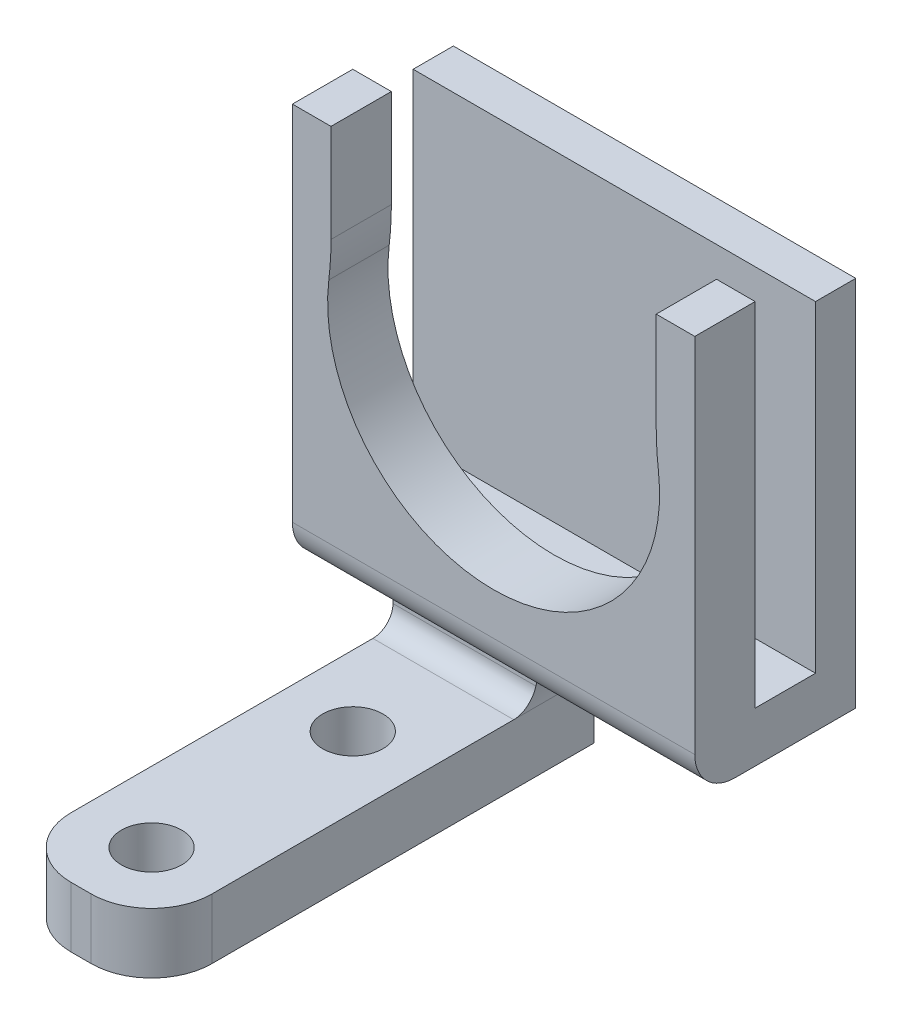
ISO-10303-21;
HEADER;
FILE_DESCRIPTION(('STEP AP214'),'2;1');
FILE_NAME('part.step','',(''),(''),'','','');
FILE_SCHEMA(('AUTOMOTIVE_DESIGN { 1 0 10303 214 1 1 1 1 }'));
ENDSEC;
DATA;
#1=APPLICATION_CONTEXT('core data for automotive mechanical design processes');
#2=APPLICATION_PROTOCOL_DEFINITION('international standard','automotive_design',2000,#1);
#3=PRODUCT_CONTEXT('',#1,'mechanical');
#4=PRODUCT('Part','Part','',(#3));
#5=PRODUCT_RELATED_PRODUCT_CATEGORY('part','',(#4));
#6=PRODUCT_DEFINITION_FORMATION('','',#4);
#7=PRODUCT_DEFINITION_CONTEXT('part definition',#1,'design');
#8=PRODUCT_DEFINITION('design','',#6,#7);
#9=PRODUCT_DEFINITION_SHAPE('','',#8);
#10=(LENGTH_UNIT() NAMED_UNIT(*) SI_UNIT(.MILLI.,.METRE.));
#11=(NAMED_UNIT(*) PLANE_ANGLE_UNIT() SI_UNIT($,.RADIAN.));
#12=(NAMED_UNIT(*) SI_UNIT($,.STERADIAN.) SOLID_ANGLE_UNIT());
#13=UNCERTAINTY_MEASURE_WITH_UNIT(LENGTH_MEASURE(1.E-05),#10,'distance_accuracy_value','');
#14=(GEOMETRIC_REPRESENTATION_CONTEXT(3) GLOBAL_UNCERTAINTY_ASSIGNED_CONTEXT((#13)) GLOBAL_UNIT_ASSIGNED_CONTEXT((#10,
#11,#12)) REPRESENTATION_CONTEXT('',''));
#15=CARTESIAN_POINT('',(0.,0.,0.));
#16=DIRECTION('',(0.,0.,1.));
#17=DIRECTION('',(1.,0.,0.));
#18=AXIS2_PLACEMENT_3D('',#15,#16,#17);
#19=CARTESIAN_POINT('',(0.,0.,3.));
#20=DIRECTION('',(0.,1.,0.));
#21=DIRECTION('',(0.,0.,1.));
#22=AXIS2_PLACEMENT_3D('',#19,#20,#21);
#23=PLANE('',#22);
#24=DIRECTION('',(0.,0.,-1.));
#25=VECTOR('',#24,1.);
#26=CARTESIAN_POINT('',(20.,0.,3.));
#27=LINE('',#26,#25);
#28=CARTESIAN_POINT('',(20.,0.,1.));
#29=VERTEX_POINT('',#28);
#30=CARTESIAN_POINT('',(20.,0.,-5.));
#31=VERTEX_POINT('',#30);
#32=EDGE_CURVE('E359',#29,#31,#27,.T.);
#33=ORIENTED_EDGE('',*,*,#32,.F.);
#34=DIRECTION('',(1.,0.,0.));
#35=VECTOR('',#34,1.);
#36=CARTESIAN_POINT('',(0.,0.,1.));
#37=LINE('',#36,#35);
#38=CARTESIAN_POINT('',(0.,0.,1.));
#39=VERTEX_POINT('',#38);
#40=EDGE_CURVE('E417',#29,#39,#37,.F.);
#41=ORIENTED_EDGE('',*,*,#40,.T.);
#42=DIRECTION('',(0.,0.,-1.));
#43=VECTOR('',#42,1.);
#44=CARTESIAN_POINT('',(0.,0.,-2.));
#45=LINE('',#44,#43);
#46=CARTESIAN_POINT('',(0.,0.,0.));
#47=VERTEX_POINT('',#46);
#48=EDGE_CURVE('E240',#39,#47,#45,.T.);
#49=ORIENTED_EDGE('',*,*,#48,.T.);
#50=DIRECTION('',(-1.,0.,0.));
#51=VECTOR('',#50,1.);
#52=CARTESIAN_POINT('',(12.,0.,0.));
#53=LINE('',#52,#51);
#54=CARTESIAN_POINT('',(12.,0.,0.));
#55=VERTEX_POINT('',#54);
#56=EDGE_CURVE('E413',#47,#55,#53,.F.);
#57=ORIENTED_EDGE('',*,*,#56,.T.);
#58=DIRECTION('',(0.,0.,1.));
#59=VECTOR('',#58,1.);
#60=CARTESIAN_POINT('',(12.,0.,-5.));
#61=LINE('',#60,#59);
#62=CARTESIAN_POINT('',(12.,0.,-5.));
#63=VERTEX_POINT('',#62);
#64=EDGE_CURVE('E397',#55,#63,#61,.F.);
#65=ORIENTED_EDGE('',*,*,#64,.T.);
#66=DIRECTION('',(-1.,0.,0.));
#67=VECTOR('',#66,1.);
#68=CARTESIAN_POINT('',(20.,0.,-5.));
#69=LINE('',#68,#67);
#70=EDGE_CURVE('E285',#31,#63,#69,.T.);
#71=ORIENTED_EDGE('',*,*,#70,.F.);
#72=EDGE_LOOP('',(#33,#41,#49,#57,#65,#71));
#73=FACE_BOUND('',#72,.T.);
#74=ADVANCED_FACE('F39',(#73),#23,.F.);
#75=CARTESIAN_POINT('',(20.,2.5,-5.));
#76=DIRECTION('',(0.,-1.,0.));
#77=DIRECTION('',(0.,0.,-1.));
#78=AXIS2_PLACEMENT_3D('',#75,#76,#77);
#79=PLANE('',#78);
#80=DIRECTION('',(1.,0.,0.));
#81=VECTOR('',#80,1.);
#82=CARTESIAN_POINT('',(20.,2.5,-3.));
#83=LINE('',#82,#81);
#84=CARTESIAN_POINT('',(0.,2.5,-3.));
#85=VERTEX_POINT('',#84);
#86=CARTESIAN_POINT('',(20.,2.5,-3.));
#87=VERTEX_POINT('',#86);
#88=EDGE_CURVE('E232',#85,#87,#83,.T.);
#89=ORIENTED_EDGE('',*,*,#88,.F.);
#90=DIRECTION('',(0.,0.,1.));
#91=VECTOR('',#90,1.);
#92=CARTESIAN_POINT('',(0.,2.5,-5.));
#93=LINE('',#92,#91);
#94=CARTESIAN_POINT('',(0.,2.5,0.));
#95=VERTEX_POINT('',#94);
#96=EDGE_CURVE('E297',#85,#95,#93,.T.);
#97=ORIENTED_EDGE('',*,*,#96,.T.);
#98=DIRECTION('',(1.,0.,0.));
#99=VECTOR('',#98,1.);
#100=CARTESIAN_POINT('',(20.,2.5,0.));
#101=LINE('',#100,#99);
#102=CARTESIAN_POINT('',(20.,2.5,0.));
#103=VERTEX_POINT('',#102);
#104=EDGE_CURVE('E281',#95,#103,#101,.T.);
#105=ORIENTED_EDGE('',*,*,#104,.T.);
#106=DIRECTION('',(0.,0.,1.));
#107=VECTOR('',#106,1.);
#108=CARTESIAN_POINT('',(20.,2.5,-5.));
#109=LINE('',#108,#107);
#110=EDGE_CURVE('E291',#87,#103,#109,.T.);
#111=ORIENTED_EDGE('',*,*,#110,.F.);
#112=EDGE_LOOP('',(#89,#97,#105,#111));
#113=FACE_BOUND('',#112,.T.);
#114=ADVANCED_FACE('F466',(#113),#79,.F.);
#115=CARTESIAN_POINT('',(10.,12.3440752769615,0.));
#116=DIRECTION('',(0.,0.,1.));
#117=DIRECTION('',(1.,0.,0.));
#118=AXIS2_PLACEMENT_3D('',#115,#116,#117);
#119=PLANE('',#118);
#120=CARTESIAN_POINT('',(10.,12.3440752769615,0.));
#121=DIRECTION('',(0.,0.,1.));
#122=DIRECTION('',(1.,0.,0.));
#123=AXIS2_PLACEMENT_3D('',#120,#121,#122);
#124=CIRCLE('',#123,8.25);
#125=CARTESIAN_POINT('',(1.80957581900882,13.3337478164588,0.));
#126=VERTEX_POINT('',#125);
#127=CARTESIAN_POINT('',(18.1904241809912,13.3337478164588,0.));
#128=VERTEX_POINT('',#127);
#129=EDGE_CURVE('E332',#126,#128,#124,.T.);
#130=ORIENTED_EDGE('',*,*,#129,.T.);
#131=CARTESIAN_POINT('',(33.082104510066,15.1331524337266,0.));
#132=DIRECTION('',(0.,0.,1.));
#133=DIRECTION('',(1.,0.,0.));
#134=AXIS2_PLACEMENT_3D('',#131,#132,#133);
#135=CIRCLE('',#134,15.);
#136=CARTESIAN_POINT('',(18.082104510066,15.1331524337266,0.));
#137=VERTEX_POINT('',#136);
#138=EDGE_CURVE('E379',#128,#137,#135,.F.);
#139=ORIENTED_EDGE('',*,*,#138,.T.);
#140=DIRECTION('',(0.,-1.,0.));
#141=VECTOR('',#140,1.);
#142=CARTESIAN_POINT('',(18.082104510066,20.,0.));
#143=LINE('',#142,#141);
#144=CARTESIAN_POINT('',(18.082104510066,20.,0.));
#145=VERTEX_POINT('',#144);
#146=EDGE_CURVE('E300',#145,#137,#143,.T.);
#147=ORIENTED_EDGE('',*,*,#146,.F.);
#148=DIRECTION('',(1.,0.,0.));
#149=VECTOR('',#148,1.);
#150=CARTESIAN_POINT('',(18.082104510066,20.,0.));
#151=LINE('',#150,#149);
#152=CARTESIAN_POINT('',(20.,20.,0.));
#153=VERTEX_POINT('',#152);
#154=EDGE_CURVE('E306',#145,#153,#151,.T.);
#155=ORIENTED_EDGE('',*,*,#154,.T.);
#156=DIRECTION('',(0.,1.,0.));
#157=VECTOR('',#156,1.);
#158=CARTESIAN_POINT('',(20.,0.,0.));
#159=LINE('',#158,#157);
#160=EDGE_CURVE('E347',#103,#153,#159,.T.);
#161=ORIENTED_EDGE('',*,*,#160,.F.);
#162=ORIENTED_EDGE('',*,*,#104,.F.);
#163=DIRECTION('',(0.,1.,0.));
#164=VECTOR('',#163,1.);
#165=CARTESIAN_POINT('',(0.,0.,0.));
#166=LINE('',#165,#164);
#167=CARTESIAN_POINT('',(0.,20.,0.));
#168=VERTEX_POINT('',#167);
#169=EDGE_CURVE('E344',#95,#168,#166,.T.);
#170=ORIENTED_EDGE('',*,*,#169,.T.);
#171=DIRECTION('',(1.,0.,0.));
#172=VECTOR('',#171,1.);
#173=CARTESIAN_POINT('',(0.,20.,0.));
#174=LINE('',#173,#172);
#175=CARTESIAN_POINT('',(1.91789548993395,20.,0.));
#176=VERTEX_POINT('',#175);
#177=EDGE_CURVE('E340',#168,#176,#174,.T.);
#178=ORIENTED_EDGE('',*,*,#177,.T.);
#179=DIRECTION('',(0.,-1.,0.));
#180=VECTOR('',#179,1.);
#181=CARTESIAN_POINT('',(1.91789548993395,20.,0.));
#182=LINE('',#181,#180);
#183=CARTESIAN_POINT('',(1.91789548993395,15.1331524337266,0.));
#184=VERTEX_POINT('',#183);
#185=EDGE_CURVE('E336',#176,#184,#182,.T.);
#186=ORIENTED_EDGE('',*,*,#185,.T.);
#187=CARTESIAN_POINT('',(-13.082104510066,15.1331524337266,0.));
#188=DIRECTION('',(0.,0.,1.));
#189=DIRECTION('',(1.,0.,0.));
#190=AXIS2_PLACEMENT_3D('',#187,#188,#189);
#191=CIRCLE('',#190,15.);
#192=EDGE_CURVE('E376',#184,#126,#191,.F.);
#193=ORIENTED_EDGE('',*,*,#192,.T.);
#194=EDGE_LOOP('',(#130,#139,#147,#155,#161,#162,#170,#178,#186,#193));
#195=FACE_BOUND('',#194,.T.);
#196=ADVANCED_FACE('F474',(#195),#119,.F.);
#197=CARTESIAN_POINT('',(18.082104510066,20.,3.));
#198=DIRECTION('',(1.,0.,0.));
#199=DIRECTION('',(0.,0.,-1.));
#200=AXIS2_PLACEMENT_3D('',#197,#198,#199);
#201=PLANE('',#200);
#202=ORIENTED_EDGE('',*,*,#146,.T.);
#203=DIRECTION('',(0.,0.,1.));
#204=VECTOR('',#203,1.);
#205=CARTESIAN_POINT('',(18.082104510066,15.1331524337266,3.));
#206=LINE('',#205,#204);
#207=CARTESIAN_POINT('',(18.082104510066,15.1331524337266,3.));
#208=VERTEX_POINT('',#207);
#209=EDGE_CURVE('E382',#137,#208,#206,.T.);
#210=ORIENTED_EDGE('',*,*,#209,.T.);
#211=DIRECTION('',(0.,-1.,0.));
#212=VECTOR('',#211,1.);
#213=CARTESIAN_POINT('',(18.082104510066,20.,3.));
#214=LINE('',#213,#212);
#215=CARTESIAN_POINT('',(18.082104510066,20.,3.));
#216=VERTEX_POINT('',#215);
#217=EDGE_CURVE('E301',#216,#208,#214,.T.);
#218=ORIENTED_EDGE('',*,*,#217,.F.);
#219=DIRECTION('',(0.,0.,-1.));
#220=VECTOR('',#219,1.);
#221=CARTESIAN_POINT('',(18.082104510066,20.,3.));
#222=LINE('',#221,#220);
#223=EDGE_CURVE('E328',#216,#145,#222,.T.);
#224=ORIENTED_EDGE('',*,*,#223,.T.);
#225=EDGE_LOOP('',(#202,#210,#218,#224));
#226=FACE_BOUND('',#225,.T.);
#227=ADVANCED_FACE('F495',(#226),#201,.F.);
#228=CARTESIAN_POINT('',(10.,12.3440752769615,3.));
#229=DIRECTION('',(0.,0.,-1.));
#230=DIRECTION('',(-1.,0.,0.));
#231=AXIS2_PLACEMENT_3D('',#228,#229,#230);
#232=CYLINDRICAL_SURFACE('',#231,8.25);
#233=CARTESIAN_POINT('',(10.,12.3440752769615,3.));
#234=DIRECTION('',(0.,0.,1.));
#235=DIRECTION('',(1.,0.,0.));
#236=AXIS2_PLACEMENT_3D('',#233,#234,#235);
#237=CIRCLE('',#236,8.25);
#238=CARTESIAN_POINT('',(1.80957581900882,13.3337478164588,3.));
#239=VERTEX_POINT('',#238);
#240=CARTESIAN_POINT('',(18.1904241809912,13.3337478164588,3.));
#241=VERTEX_POINT('',#240);
#242=EDGE_CURVE('E305',#239,#241,#237,.T.);
#243=ORIENTED_EDGE('',*,*,#242,.T.);
#244=DIRECTION('',(0.,0.,-1.));
#245=VECTOR('',#244,1.);
#246=CARTESIAN_POINT('',(18.1904241809912,13.3337478164588,3.));
#247=LINE('',#246,#245);
#248=EDGE_CURVE('E372',#241,#128,#247,.T.);
#249=ORIENTED_EDGE('',*,*,#248,.T.);
#250=ORIENTED_EDGE('',*,*,#129,.F.);
#251=DIRECTION('',(0.,0.,-1.));
#252=VECTOR('',#251,1.);
#253=CARTESIAN_POINT('',(1.80957581900882,13.3337478164588,3.));
#254=LINE('',#253,#252);
#255=EDGE_CURVE('E369',#126,#239,#254,.F.);
#256=ORIENTED_EDGE('',*,*,#255,.T.);
#257=EDGE_LOOP('',(#243,#249,#250,#256));
#258=FACE_BOUND('',#257,.T.);
#259=ADVANCED_FACE('F491',(#258),#232,.F.);
#260=CARTESIAN_POINT('',(1.91789548993395,20.,3.));
#261=DIRECTION('',(1.,0.,0.));
#262=DIRECTION('',(0.,1.,0.));
#263=AXIS2_PLACEMENT_3D('',#260,#261,#262);
#264=PLANE('',#263);
#265=DIRECTION('',(0.,-1.,0.));
#266=VECTOR('',#265,1.);
#267=CARTESIAN_POINT('',(1.91789548993395,20.,3.));
#268=LINE('',#267,#266);
#269=CARTESIAN_POINT('',(1.91789548993395,20.,3.));
#270=VERTEX_POINT('',#269);
#271=CARTESIAN_POINT('',(1.91789548993395,15.1331524337266,3.));
#272=VERTEX_POINT('',#271);
#273=EDGE_CURVE('E310',#270,#272,#268,.T.);
#274=ORIENTED_EDGE('',*,*,#273,.T.);
#275=DIRECTION('',(0.,0.,-1.));
#276=VECTOR('',#275,1.);
#277=CARTESIAN_POINT('',(1.91789548993395,15.1331524337266,3.));
#278=LINE('',#277,#276);
#279=EDGE_CURVE('E391',#272,#184,#278,.T.);
#280=ORIENTED_EDGE('',*,*,#279,.T.);
#281=ORIENTED_EDGE('',*,*,#185,.F.);
#282=DIRECTION('',(0.,0.,-1.));
#283=VECTOR('',#282,1.);
#284=CARTESIAN_POINT('',(1.91789548993395,20.,3.));
#285=LINE('',#284,#283);
#286=EDGE_CURVE('E366',#270,#176,#285,.T.);
#287=ORIENTED_EDGE('',*,*,#286,.F.);
#288=EDGE_LOOP('',(#274,#280,#281,#287));
#289=FACE_BOUND('',#288,.T.);
#290=ADVANCED_FACE('F487',(#289),#264,.T.);
#291=CARTESIAN_POINT('',(0.,20.,3.));
#292=DIRECTION('',(0.,1.,0.));
#293=DIRECTION('',(0.,0.,1.));
#294=AXIS2_PLACEMENT_3D('',#291,#292,#293);
#295=PLANE('',#294);
#296=ORIENTED_EDGE('',*,*,#177,.F.);
#297=DIRECTION('',(0.,0.,-1.));
#298=VECTOR('',#297,1.);
#299=CARTESIAN_POINT('',(0.,20.,3.));
#300=LINE('',#299,#298);
#301=CARTESIAN_POINT('',(0.,20.,3.));
#302=VERTEX_POINT('',#301);
#303=EDGE_CURVE('E362',#302,#168,#300,.T.);
#304=ORIENTED_EDGE('',*,*,#303,.F.);
#305=DIRECTION('',(1.,0.,0.));
#306=VECTOR('',#305,1.);
#307=CARTESIAN_POINT('',(0.,20.,3.));
#308=LINE('',#307,#306);
#309=EDGE_CURVE('E314',#302,#270,#308,.T.);
#310=ORIENTED_EDGE('',*,*,#309,.T.);
#311=ORIENTED_EDGE('',*,*,#286,.T.);
#312=EDGE_LOOP('',(#296,#304,#310,#311));
#313=FACE_BOUND('',#312,.T.);
#314=ADVANCED_FACE('F484',(#313),#295,.T.);
#315=CARTESIAN_POINT('',(0.,0.,3.));
#316=DIRECTION('',(-1.,0.,0.));
#317=DIRECTION('',(0.,0.,1.));
#318=AXIS2_PLACEMENT_3D('',#315,#316,#317);
#319=PLANE('',#318);
#320=DIRECTION('',(0.,0.,-1.));
#321=VECTOR('',#320,1.);
#322=CARTESIAN_POINT('',(0.,-8.,17.));
#323=LINE('',#322,#321);
#324=CARTESIAN_POINT('',(0.,-8.,14.));
#325=VERTEX_POINT('',#324);
#326=CARTESIAN_POINT('',(0.,-8.,-5.));
#327=VERTEX_POINT('',#326);
#328=EDGE_CURVE('E220',#325,#327,#323,.T.);
#329=ORIENTED_EDGE('',*,*,#328,.F.);
#330=DIRECTION('',(0.,-1.,0.));
#331=VECTOR('',#330,1.);
#332=CARTESIAN_POINT('',(0.,-5.,14.));
#333=LINE('',#332,#331);
#334=CARTESIAN_POINT('',(0.,-5.,14.));
#335=VERTEX_POINT('',#334);
#336=EDGE_CURVE('E631',#325,#335,#333,.F.);
#337=ORIENTED_EDGE('',*,*,#336,.T.);
#338=DIRECTION('',(0.,0.,-1.));
#339=VECTOR('',#338,1.);
#340=CARTESIAN_POINT('',(0.,-5.,17.));
#341=LINE('',#340,#339);
#342=CARTESIAN_POINT('',(0.,-5.,-1.));
#343=VERTEX_POINT('',#342);
#344=EDGE_CURVE('E253',#335,#343,#341,.T.);
#345=ORIENTED_EDGE('',*,*,#344,.T.);
#346=CARTESIAN_POINT('',(0.,-4.,-1.));
#347=DIRECTION('',(-1.,0.,0.));
#348=DIRECTION('',(0.,0.,1.));
#349=AXIS2_PLACEMENT_3D('',#346,#347,#348);
#350=CIRCLE('',#349,1.);
#351=CARTESIAN_POINT('',(0.,-4.,-2.));
#352=VERTEX_POINT('',#351);
#353=EDGE_CURVE('E54',#343,#352,#350,.F.);
#354=ORIENTED_EDGE('',*,*,#353,.T.);
#355=DIRECTION('',(0.,-1.,0.));
#356=VECTOR('',#355,1.);
#357=CARTESIAN_POINT('',(0.,0.,-2.));
#358=LINE('',#357,#356);
#359=CARTESIAN_POINT('',(0.,-2.,-2.));
#360=VERTEX_POINT('',#359);
#361=EDGE_CURVE('E247',#360,#352,#358,.T.);
#362=ORIENTED_EDGE('',*,*,#361,.F.);
#363=CARTESIAN_POINT('',(0.,-2.,0.));
#364=DIRECTION('',(-1.,0.,0.));
#365=DIRECTION('',(0.,0.,1.));
#366=AXIS2_PLACEMENT_3D('',#363,#364,#365);
#367=CIRCLE('',#366,2.);
#368=EDGE_CURVE('E427',#360,#47,#367,.F.);
#369=ORIENTED_EDGE('',*,*,#368,.T.);
#370=ORIENTED_EDGE('',*,*,#48,.F.);
#371=CARTESIAN_POINT('',(0.,2.,1.));
#372=DIRECTION('',(-1.,0.,0.));
#373=DIRECTION('',(0.,0.,1.));
#374=AXIS2_PLACEMENT_3D('',#371,#372,#373);
#375=CIRCLE('',#374,2.);
#376=CARTESIAN_POINT('',(0.,2.,3.));
#377=VERTEX_POINT('',#376);
#378=EDGE_CURVE('E420',#39,#377,#375,.T.);
#379=ORIENTED_EDGE('',*,*,#378,.T.);
#380=DIRECTION('',(0.,1.,0.));
#381=VECTOR('',#380,1.);
#382=CARTESIAN_POINT('',(0.,0.,3.));
#383=LINE('',#382,#381);
#384=EDGE_CURVE('E318',#377,#302,#383,.T.);
#385=ORIENTED_EDGE('',*,*,#384,.T.);
#386=ORIENTED_EDGE('',*,*,#303,.T.);
#387=ORIENTED_EDGE('',*,*,#169,.F.);
#388=ORIENTED_EDGE('',*,*,#96,.F.);
#389=DIRECTION('',(0.,-1.,0.));
#390=VECTOR('',#389,1.);
#391=CARTESIAN_POINT('',(0.,18.5,-3.));
#392=LINE('',#391,#390);
#393=CARTESIAN_POINT('',(0.,18.5,-3.));
#394=VERTEX_POINT('',#393);
#395=EDGE_CURVE('E278',#394,#85,#392,.T.);
#396=ORIENTED_EDGE('',*,*,#395,.F.);
#397=DIRECTION('',(0.,0.,1.));
#398=VECTOR('',#397,1.);
#399=CARTESIAN_POINT('',(0.,18.5,-5.));
#400=LINE('',#399,#398);
#401=CARTESIAN_POINT('',(0.,18.5,-5.));
#402=VERTEX_POINT('',#401);
#403=EDGE_CURVE('E266',#402,#394,#400,.T.);
#404=ORIENTED_EDGE('',*,*,#403,.F.);
#405=DIRECTION('',(0.,1.,0.));
#406=VECTOR('',#405,1.);
#407=CARTESIAN_POINT('',(0.,0.,-5.));
#408=LINE('',#407,#406);
#409=EDGE_CURVE('E288',#327,#402,#408,.T.);
#410=ORIENTED_EDGE('',*,*,#409,.F.);
#411=EDGE_LOOP('',(#329,#337,#345,#354,#362,#369,#370,#379,#385,#386,#387,#388,#396,#404,#410));
#412=FACE_BOUND('',#411,.T.);
#413=ADVANCED_FACE('F482',(#412),#319,.T.);
#414=CARTESIAN_POINT('',(20.,0.,3.));
#415=DIRECTION('',(-1.,0.,0.));
#416=DIRECTION('',(0.,0.,1.));
#417=AXIS2_PLACEMENT_3D('',#414,#415,#416);
#418=PLANE('',#417);
#419=DIRECTION('',(0.,1.,0.));
#420=VECTOR('',#419,1.);
#421=CARTESIAN_POINT('',(20.,0.,3.));
#422=LINE('',#421,#420);
#423=CARTESIAN_POINT('',(20.,2.,3.));
#424=VERTEX_POINT('',#423);
#425=CARTESIAN_POINT('',(20.,20.,3.));
#426=VERTEX_POINT('',#425);
#427=EDGE_CURVE('E321',#424,#426,#422,.T.);
#428=ORIENTED_EDGE('',*,*,#427,.F.);
#429=CARTESIAN_POINT('',(20.,2.,1.));
#430=DIRECTION('',(-1.,0.,0.));
#431=DIRECTION('',(0.,0.,1.));
#432=AXIS2_PLACEMENT_3D('',#429,#430,#431);
#433=CIRCLE('',#432,2.);
#434=EDGE_CURVE('E410',#424,#29,#433,.F.);
#435=ORIENTED_EDGE('',*,*,#434,.T.);
#436=ORIENTED_EDGE('',*,*,#32,.T.);
#437=DIRECTION('',(0.,-1.,0.));
#438=VECTOR('',#437,1.);
#439=CARTESIAN_POINT('',(20.,0.,-5.));
#440=LINE('',#439,#438);
#441=CARTESIAN_POINT('',(20.,18.5,-5.));
#442=VERTEX_POINT('',#441);
#443=EDGE_CURVE('E282',#442,#31,#440,.T.);
#444=ORIENTED_EDGE('',*,*,#443,.F.);
#445=DIRECTION('',(0.,0.,-1.));
#446=VECTOR('',#445,1.);
#447=CARTESIAN_POINT('',(20.,18.5,-5.));
#448=LINE('',#447,#446);
#449=CARTESIAN_POINT('',(20.,18.5,-3.));
#450=VERTEX_POINT('',#449);
#451=EDGE_CURVE('E258',#450,#442,#448,.T.);
#452=ORIENTED_EDGE('',*,*,#451,.F.);
#453=DIRECTION('',(0.,-1.,0.));
#454=VECTOR('',#453,1.);
#455=CARTESIAN_POINT('',(20.,18.5,-3.));
#456=LINE('',#455,#454);
#457=EDGE_CURVE('E272',#450,#87,#456,.T.);
#458=ORIENTED_EDGE('',*,*,#457,.T.);
#459=ORIENTED_EDGE('',*,*,#110,.T.);
#460=ORIENTED_EDGE('',*,*,#160,.T.);
#461=DIRECTION('',(0.,0.,-1.));
#462=VECTOR('',#461,1.);
#463=CARTESIAN_POINT('',(20.,20.,3.));
#464=LINE('',#463,#462);
#465=EDGE_CURVE('E355',#426,#153,#464,.T.);
#466=ORIENTED_EDGE('',*,*,#465,.F.);
#467=EDGE_LOOP('',(#428,#435,#436,#444,#452,#458,#459,#460,#466));
#468=FACE_BOUND('',#467,.T.);
#469=ADVANCED_FACE('F480',(#468),#418,.F.);
#470=CARTESIAN_POINT('',(18.082104510066,20.,3.));
#471=DIRECTION('',(0.,1.,0.));
#472=DIRECTION('',(0.,0.,1.));
#473=AXIS2_PLACEMENT_3D('',#470,#471,#472);
#474=PLANE('',#473);
#475=ORIENTED_EDGE('',*,*,#154,.F.);
#476=ORIENTED_EDGE('',*,*,#223,.F.);
#477=DIRECTION('',(1.,0.,0.));
#478=VECTOR('',#477,1.);
#479=CARTESIAN_POINT('',(18.082104510066,20.,3.));
#480=LINE('',#479,#478);
#481=EDGE_CURVE('E324',#216,#426,#480,.T.);
#482=ORIENTED_EDGE('',*,*,#481,.T.);
#483=ORIENTED_EDGE('',*,*,#465,.T.);
#484=EDGE_LOOP('',(#475,#476,#482,#483));
#485=FACE_BOUND('',#484,.T.);
#486=ADVANCED_FACE('F552',(#485),#474,.T.);
#487=CARTESIAN_POINT('',(10.,12.3440752769615,3.));
#488=DIRECTION('',(0.,0.,1.));
#489=DIRECTION('',(1.,0.,0.));
#490=AXIS2_PLACEMENT_3D('',#487,#488,#489);
#491=PLANE('',#490);
#492=ORIENTED_EDGE('',*,*,#384,.F.);
#493=DIRECTION('',(1.,0.,0.));
#494=VECTOR('',#493,1.);
#495=CARTESIAN_POINT('',(20.,2.,3.));
#496=LINE('',#495,#494);
#497=EDGE_CURVE('E406',#377,#424,#496,.T.);
#498=ORIENTED_EDGE('',*,*,#497,.T.);
#499=ORIENTED_EDGE('',*,*,#427,.T.);
#500=ORIENTED_EDGE('',*,*,#481,.F.);
#501=ORIENTED_EDGE('',*,*,#217,.T.);
#502=CARTESIAN_POINT('',(33.082104510066,15.1331524337266,3.));
#503=DIRECTION('',(0.,0.,1.));
#504=DIRECTION('',(1.,0.,0.));
#505=AXIS2_PLACEMENT_3D('',#502,#503,#504);
#506=CIRCLE('',#505,15.);
#507=EDGE_CURVE('E388',#208,#241,#506,.T.);
#508=ORIENTED_EDGE('',*,*,#507,.T.);
#509=ORIENTED_EDGE('',*,*,#242,.F.);
#510=CARTESIAN_POINT('',(-13.082104510066,15.1331524337266,3.));
#511=DIRECTION('',(0.,0.,1.));
#512=DIRECTION('',(1.,0.,0.));
#513=AXIS2_PLACEMENT_3D('',#510,#511,#512);
#514=CIRCLE('',#513,15.);
#515=EDGE_CURVE('E385',#239,#272,#514,.T.);
#516=ORIENTED_EDGE('',*,*,#515,.T.);
#517=ORIENTED_EDGE('',*,*,#273,.F.);
#518=ORIENTED_EDGE('',*,*,#309,.F.);
#519=EDGE_LOOP('',(#492,#498,#499,#500,#501,#508,#509,#516,#517,#518));
#520=FACE_BOUND('',#519,.T.);
#521=ADVANCED_FACE('F516',(#520),#491,.T.);
#522=CARTESIAN_POINT('',(0.,0.,-5.));
#523=DIRECTION('',(0.,0.,1.));
#524=DIRECTION('',(1.,0.,0.));
#525=AXIS2_PLACEMENT_3D('',#522,#523,#524);
#526=PLANE('',#525);
#527=ORIENTED_EDGE('',*,*,#443,.T.);
#528=ORIENTED_EDGE('',*,*,#70,.T.);
#529=CARTESIAN_POINT('',(12.,-5.,-5.));
#530=DIRECTION('',(0.,0.,1.));
#531=DIRECTION('',(1.,0.,0.));
#532=AXIS2_PLACEMENT_3D('',#529,#530,#531);
#533=CIRCLE('',#532,5.);
#534=CARTESIAN_POINT('',(7.,-5.,-5.));
#535=VERTEX_POINT('',#534);
#536=EDGE_CURVE('E230',#63,#535,#533,.T.);
#537=ORIENTED_EDGE('',*,*,#536,.T.);
#538=DIRECTION('',(0.,1.,0.));
#539=VECTOR('',#538,1.);
#540=CARTESIAN_POINT('',(7.,-5.,-5.));
#541=LINE('',#540,#539);
#542=CARTESIAN_POINT('',(7.,-8.,-5.));
#543=VERTEX_POINT('',#542);
#544=EDGE_CURVE('E214',#543,#535,#541,.T.);
#545=ORIENTED_EDGE('',*,*,#544,.F.);
#546=DIRECTION('',(-1.,0.,0.));
#547=VECTOR('',#546,1.);
#548=CARTESIAN_POINT('',(7.,-8.,-5.));
#549=LINE('',#548,#547);
#550=EDGE_CURVE('E227',#543,#327,#549,.T.);
#551=ORIENTED_EDGE('',*,*,#550,.T.);
#552=ORIENTED_EDGE('',*,*,#409,.T.);
#553=DIRECTION('',(-1.,0.,0.));
#554=VECTOR('',#553,1.);
#555=CARTESIAN_POINT('',(20.,18.5,-5.));
#556=LINE('',#555,#554);
#557=EDGE_CURVE('E262',#442,#402,#556,.T.);
#558=ORIENTED_EDGE('',*,*,#557,.F.);
#559=EDGE_LOOP('',(#527,#528,#537,#545,#551,#552,#558));
#560=FACE_BOUND('',#559,.T.);
#561=ADVANCED_FACE('F226',(#560),#526,.F.);
#562=CARTESIAN_POINT('',(20.,18.5,-3.));
#563=DIRECTION('',(0.,0.,-1.));
#564=DIRECTION('',(-1.,0.,0.));
#565=AXIS2_PLACEMENT_3D('',#562,#563,#564);
#566=PLANE('',#565);
#567=ORIENTED_EDGE('',*,*,#88,.T.);
#568=ORIENTED_EDGE('',*,*,#457,.F.);
#569=DIRECTION('',(1.,0.,0.));
#570=VECTOR('',#569,1.);
#571=CARTESIAN_POINT('',(20.,18.5,-3.));
#572=LINE('',#571,#570);
#573=EDGE_CURVE('E269',#394,#450,#572,.T.);
#574=ORIENTED_EDGE('',*,*,#573,.F.);
#575=ORIENTED_EDGE('',*,*,#395,.T.);
#576=EDGE_LOOP('',(#567,#568,#574,#575));
#577=FACE_BOUND('',#576,.T.);
#578=ADVANCED_FACE('F507',(#577),#566,.F.);
#579=CARTESIAN_POINT('',(0.,18.5,0.));
#580=DIRECTION('',(0.,-1.,0.));
#581=DIRECTION('',(0.,0.,-1.));
#582=AXIS2_PLACEMENT_3D('',#579,#580,#581);
#583=PLANE('',#582);
#584=ORIENTED_EDGE('',*,*,#451,.T.);
#585=ORIENTED_EDGE('',*,*,#557,.T.);
#586=ORIENTED_EDGE('',*,*,#403,.T.);
#587=ORIENTED_EDGE('',*,*,#573,.T.);
#588=EDGE_LOOP('',(#584,#585,#586,#587));
#589=FACE_BOUND('',#588,.T.);
#590=ADVANCED_FACE('F501',(#589),#583,.F.);
#591=CARTESIAN_POINT('',(33.082104510066,15.1331524337266,3.));
#592=DIRECTION('',(0.,0.,-1.));
#593=DIRECTION('',(-1.,0.,0.));
#594=AXIS2_PLACEMENT_3D('',#591,#592,#593);
#595=CYLINDRICAL_SURFACE('',#594,15.);
#596=ORIENTED_EDGE('',*,*,#507,.F.);
#597=ORIENTED_EDGE('',*,*,#209,.F.);
#598=ORIENTED_EDGE('',*,*,#138,.F.);
#599=ORIENTED_EDGE('',*,*,#248,.F.);
#600=EDGE_LOOP('',(#596,#597,#598,#599));
#601=FACE_BOUND('',#600,.T.);
#602=ADVANCED_FACE('F499',(#601),#595,.T.);
#603=CARTESIAN_POINT('',(-13.082104510066,15.1331524337266,3.));
#604=DIRECTION('',(0.,0.,-1.));
#605=DIRECTION('',(-1.,0.,0.));
#606=AXIS2_PLACEMENT_3D('',#603,#604,#605);
#607=CYLINDRICAL_SURFACE('',#606,15.);
#608=ORIENTED_EDGE('',*,*,#515,.F.);
#609=ORIENTED_EDGE('',*,*,#255,.F.);
#610=ORIENTED_EDGE('',*,*,#192,.F.);
#611=ORIENTED_EDGE('',*,*,#279,.F.);
#612=EDGE_LOOP('',(#608,#609,#610,#611));
#613=FACE_BOUND('',#612,.T.);
#614=ADVANCED_FACE('F450',(#613),#607,.T.);
#615=CARTESIAN_POINT('',(7.,-5.,-5.));
#616=DIRECTION('',(-1.,0.,0.));
#617=DIRECTION('',(0.,0.,1.));
#618=AXIS2_PLACEMENT_3D('',#615,#616,#617);
#619=PLANE('',#618);
#620=DIRECTION('',(0.,0.,-1.));
#621=VECTOR('',#620,1.);
#622=CARTESIAN_POINT('',(7.,-5.,17.));
#623=LINE('',#622,#621);
#624=CARTESIAN_POINT('',(7.,-5.,14.));
#625=VERTEX_POINT('',#624);
#626=CARTESIAN_POINT('',(7.,-5.,-1.));
#627=VERTEX_POINT('',#626);
#628=EDGE_CURVE('E233',#625,#627,#623,.T.);
#629=ORIENTED_EDGE('',*,*,#628,.F.);
#630=DIRECTION('',(0.,-1.,0.));
#631=VECTOR('',#630,1.);
#632=CARTESIAN_POINT('',(7.,-5.,14.));
#633=LINE('',#632,#631);
#634=CARTESIAN_POINT('',(7.,-8.,14.));
#635=VERTEX_POINT('',#634);
#636=EDGE_CURVE('E216',#625,#635,#633,.T.);
#637=ORIENTED_EDGE('',*,*,#636,.T.);
#638=DIRECTION('',(0.,0.,-1.));
#639=VECTOR('',#638,1.);
#640=CARTESIAN_POINT('',(7.,-8.,17.));
#641=LINE('',#640,#639);
#642=EDGE_CURVE('E211',#635,#543,#641,.T.);
#643=ORIENTED_EDGE('',*,*,#642,.T.);
#644=ORIENTED_EDGE('',*,*,#544,.T.);
#645=DIRECTION('',(0.,0.,1.));
#646=VECTOR('',#645,1.);
#647=CARTESIAN_POINT('',(7.,-5.,3.));
#648=LINE('',#647,#646);
#649=EDGE_CURVE('E61',#535,#627,#648,.T.);
#650=ORIENTED_EDGE('',*,*,#649,.T.);
#651=EDGE_LOOP('',(#629,#637,#643,#644,#650));
#652=FACE_BOUND('',#651,.T.);
#653=ADVANCED_FACE('F213',(#652),#619,.F.);
#654=CARTESIAN_POINT('',(7.,-5.,17.));
#655=DIRECTION('',(0.,-1.,0.));
#656=DIRECTION('',(0.,0.,-1.));
#657=AXIS2_PLACEMENT_3D('',#654,#655,#656);
#658=PLANE('',#657);
#659=CARTESIAN_POINT('',(3.5,-5.,3.5));
#660=DIRECTION('',(0.,-1.,0.));
#661=DIRECTION('',(0.,0.,-1.));
#662=AXIS2_PLACEMENT_3D('',#659,#660,#661);
#663=CIRCLE('',#662,1.5);
#664=CARTESIAN_POINT('',(3.5,-5.,2.));
#665=VERTEX_POINT('',#664);
#666=EDGE_CURVE('E597',#665,#665,#663,.T.);
#667=ORIENTED_EDGE('',*,*,#666,.T.);
#668=EDGE_LOOP('',(#667));
#669=FACE_BOUND('',#668,.T.);
#670=CARTESIAN_POINT('',(3.5,-5.,13.5));
#671=DIRECTION('',(0.,-1.,0.));
#672=DIRECTION('',(0.,0.,-1.));
#673=AXIS2_PLACEMENT_3D('',#670,#671,#672);
#674=CIRCLE('',#673,1.5);
#675=CARTESIAN_POINT('',(3.5,-5.,12.));
#676=VERTEX_POINT('',#675);
#677=EDGE_CURVE('E599',#676,#676,#674,.T.);
#678=ORIENTED_EDGE('',*,*,#677,.T.);
#679=EDGE_LOOP('',(#678));
#680=FACE_BOUND('',#679,.T.);
#681=ORIENTED_EDGE('',*,*,#628,.T.);
#682=DIRECTION('',(-1.,0.,0.));
#683=VECTOR('',#682,1.);
#684=CARTESIAN_POINT('',(0.,-5.,-1.));
#685=LINE('',#684,#683);
#686=EDGE_CURVE('E621',#627,#343,#685,.T.);
#687=ORIENTED_EDGE('',*,*,#686,.T.);
#688=ORIENTED_EDGE('',*,*,#344,.F.);
#689=CARTESIAN_POINT('',(3.,-5.,14.));
#690=DIRECTION('',(0.,-1.,0.));
#691=DIRECTION('',(0.,0.,-1.));
#692=AXIS2_PLACEMENT_3D('',#689,#690,#691);
#693=CIRCLE('',#692,3.);
#694=CARTESIAN_POINT('',(3.,-5.,17.));
#695=VERTEX_POINT('',#694);
#696=EDGE_CURVE('E641',#335,#695,#693,.F.);
#697=ORIENTED_EDGE('',*,*,#696,.T.);
#698=DIRECTION('',(-1.,0.,0.));
#699=VECTOR('',#698,1.);
#700=CARTESIAN_POINT('',(7.,-5.,17.));
#701=LINE('',#700,#699);
#702=CARTESIAN_POINT('',(4.,-5.,17.));
#703=VERTEX_POINT('',#702);
#704=EDGE_CURVE('E221',#703,#695,#701,.T.);
#705=ORIENTED_EDGE('',*,*,#704,.F.);
#706=CARTESIAN_POINT('',(4.,-5.,14.));
#707=DIRECTION('',(0.,-1.,0.));
#708=DIRECTION('',(0.,0.,-1.));
#709=AXIS2_PLACEMENT_3D('',#706,#707,#708);
#710=CIRCLE('',#709,3.);
#711=EDGE_CURVE('E624',#703,#625,#710,.F.);
#712=ORIENTED_EDGE('',*,*,#711,.T.);
#713=EDGE_LOOP('',(#681,#687,#688,#697,#705,#712));
#714=FACE_BOUND('',#713,.T.);
#715=ADVANCED_FACE('F569',(#669,#680,#714),#658,.F.);
#716=CARTESIAN_POINT('',(7.,-8.,17.));
#717=DIRECTION('',(0.,-1.,0.));
#718=DIRECTION('',(0.,0.,-1.));
#719=AXIS2_PLACEMENT_3D('',#716,#717,#718);
#720=PLANE('',#719);
#721=CARTESIAN_POINT('',(3.5,-8.,3.5));
#722=DIRECTION('',(0.,-1.,0.));
#723=DIRECTION('',(0.,0.,-1.));
#724=AXIS2_PLACEMENT_3D('',#721,#722,#723);
#725=CIRCLE('',#724,1.5);
#726=CARTESIAN_POINT('',(3.5,-8.,2.));
#727=VERTEX_POINT('',#726);
#728=EDGE_CURVE('E594',#727,#727,#725,.T.);
#729=ORIENTED_EDGE('',*,*,#728,.F.);
#730=EDGE_LOOP('',(#729));
#731=FACE_BOUND('',#730,.T.);
#732=CARTESIAN_POINT('',(3.5,-8.,13.5));
#733=DIRECTION('',(0.,-1.,0.));
#734=DIRECTION('',(0.,0.,-1.));
#735=AXIS2_PLACEMENT_3D('',#732,#733,#734);
#736=CIRCLE('',#735,1.5);
#737=CARTESIAN_POINT('',(3.5,-8.,12.));
#738=VERTEX_POINT('',#737);
#739=EDGE_CURVE('E607',#738,#738,#736,.T.);
#740=ORIENTED_EDGE('',*,*,#739,.F.);
#741=EDGE_LOOP('',(#740));
#742=FACE_BOUND('',#741,.T.);
#743=ORIENTED_EDGE('',*,*,#642,.F.);
#744=CARTESIAN_POINT('',(4.,-8.,14.));
#745=DIRECTION('',(0.,-1.,0.));
#746=DIRECTION('',(0.,0.,-1.));
#747=AXIS2_PLACEMENT_3D('',#744,#745,#746);
#748=CIRCLE('',#747,3.);
#749=CARTESIAN_POINT('',(4.,-8.,17.));
#750=VERTEX_POINT('',#749);
#751=EDGE_CURVE('E651',#635,#750,#748,.T.);
#752=ORIENTED_EDGE('',*,*,#751,.T.);
#753=DIRECTION('',(-1.,0.,0.));
#754=VECTOR('',#753,1.);
#755=CARTESIAN_POINT('',(7.,-8.,17.));
#756=LINE('',#755,#754);
#757=CARTESIAN_POINT('',(3.,-8.,17.));
#758=VERTEX_POINT('',#757);
#759=EDGE_CURVE('E239',#750,#758,#756,.T.);
#760=ORIENTED_EDGE('',*,*,#759,.T.);
#761=CARTESIAN_POINT('',(3.,-8.,14.));
#762=DIRECTION('',(0.,-1.,0.));
#763=DIRECTION('',(0.,0.,-1.));
#764=AXIS2_PLACEMENT_3D('',#761,#762,#763);
#765=CIRCLE('',#764,3.);
#766=EDGE_CURVE('E653',#758,#325,#765,.T.);
#767=ORIENTED_EDGE('',*,*,#766,.T.);
#768=ORIENTED_EDGE('',*,*,#328,.T.);
#769=ORIENTED_EDGE('',*,*,#550,.F.);
#770=EDGE_LOOP('',(#743,#752,#760,#767,#768,#769));
#771=FACE_BOUND('',#770,.T.);
#772=ADVANCED_FACE('F235',(#731,#742,#771),#720,.T.);
#773=CARTESIAN_POINT('',(0.,0.,17.));
#774=DIRECTION('',(0.,0.,-1.));
#775=DIRECTION('',(-1.,0.,0.));
#776=AXIS2_PLACEMENT_3D('',#773,#774,#775);
#777=PLANE('',#776);
#778=ORIENTED_EDGE('',*,*,#759,.F.);
#779=DIRECTION('',(0.,-1.,0.));
#780=VECTOR('',#779,1.);
#781=CARTESIAN_POINT('',(4.,0.,17.));
#782=LINE('',#781,#780);
#783=EDGE_CURVE('E644',#750,#703,#782,.F.);
#784=ORIENTED_EDGE('',*,*,#783,.T.);
#785=ORIENTED_EDGE('',*,*,#704,.T.);
#786=DIRECTION('',(0.,-1.,0.));
#787=VECTOR('',#786,1.);
#788=CARTESIAN_POINT('',(3.,-8.,17.));
#789=LINE('',#788,#787);
#790=EDGE_CURVE('E647',#695,#758,#789,.T.);
#791=ORIENTED_EDGE('',*,*,#790,.T.);
#792=EDGE_LOOP('',(#778,#784,#785,#791));
#793=FACE_BOUND('',#792,.T.);
#794=ADVANCED_FACE('F448',(#793),#777,.F.);
#795=CARTESIAN_POINT('',(12.,-5.,-5.));
#796=DIRECTION('',(0.,0.,-1.));
#797=DIRECTION('',(-1.,0.,0.));
#798=AXIS2_PLACEMENT_3D('',#795,#796,#797);
#799=CYLINDRICAL_SURFACE('',#798,5.);
#800=ORIENTED_EDGE('',*,*,#64,.F.);
#801=CARTESIAN_POINT('',(8.,-2.,-2.));
#802=CARTESIAN_POINT('',(8.05129193893794,-1.93158584431927,-1.99999324027343));
#803=CARTESIAN_POINT('',(8.10432219050442,-1.86455821852767,-1.99649157203367));
#804=CARTESIAN_POINT('',(8.21332731033455,-1.73376301953586,-1.98328909709585));
#805=CARTESIAN_POINT('',(8.2692969306262,-1.66999001182353,-1.97359901559982));
#806=CARTESIAN_POINT('',(8.3832847643709,-1.54654150724053,-1.94892281271752));
#807=CARTESIAN_POINT('',(8.4412784471596,-1.48683282305515,-1.93398790953143));
#808=CARTESIAN_POINT('',(8.55947323824071,-1.37100202672924,-1.89947772515856));
#809=CARTESIAN_POINT('',(8.61967562411216,-1.3148820435623,-1.87989972131968));
#810=CARTESIAN_POINT('',(8.76789143803193,-1.18332284605752,-1.82755585094215));
#811=CARTESIAN_POINT('',(8.85686979366094,-1.10978618138672,-1.79271857529362));
#812=CARTESIAN_POINT('',(9.03781490340132,-0.970294307628849,-1.71639941519364));
#813=CARTESIAN_POINT('',(9.12978239550721,-0.904340989331173,-1.67491587974503));
#814=CARTESIAN_POINT('',(9.41032568053489,-0.716973301253276,-1.54188878041783));
#815=CARTESIAN_POINT('',(9.60264881082764,-0.606831849482494,-1.44210610731429));
#816=CARTESIAN_POINT('',(9.93600680868792,-0.443284849854605,-1.25973640075639));
#817=CARTESIAN_POINT('',(10.0756041550304,-0.382705445541236,-1.1806465107246));
#818=CARTESIAN_POINT('',(10.3570864580454,-0.275222850353257,-1.01720624205802));
#819=CARTESIAN_POINT('',(10.4989723932581,-0.228325682510789,-0.932853566475507));
#820=CARTESIAN_POINT('',(10.7839512736836,-0.147875885213627,-0.760688566339835));
#821=CARTESIAN_POINT('',(10.9270410934602,-0.114295694698618,-0.672883804920187));
#822=CARTESIAN_POINT('',(11.2141274184523,-0.059985731058197,-0.494967808666625));
#823=CARTESIAN_POINT('',(11.3581236186322,-0.0392518461052326,-0.404857321472338));
#824=CARTESIAN_POINT('',(11.6640741180217,-0.00865251719646526,-0.212445214316999));
#825=CARTESIAN_POINT('',(11.8260977799998,-0.000401307390571128,-0.109985110385002));
#826=CARTESIAN_POINT('',(11.9920318535132,-4.76459274949052E-06,-0.005039497680998));
#827=CARTESIAN_POINT('',(11.9960159521505,-2.95223301140028E-09,-0.00251973242461563));
#828=CARTESIAN_POINT('',(12.,0.,0.));
#829=B_SPLINE_CURVE_WITH_KNOTS('',3,(#801,#802,#803,#804,#805,#806,#807,#808,#809,#810,#811,
#812,#813,#814,#815,#816,#817,#818,#819,#820,#821,#822,#823,#824,#825,#826,#827,#828),
.UNSPECIFIED.,.F.,.F.,(4,2,2,2,2,2,2,2,2,2,2,2,2,4),(0.,0.256323586120879,0.512204136350948,
0.765652360303693,1.01924957198092,1.38041574025909,1.74167176531567,2.46784096790537,
2.98178501814789,3.49595497056344,4.00905516339228,4.52199103886928,5.09684964624113,
5.11099178908029),.UNSPECIFIED.);
#830=CARTESIAN_POINT('',(8.,-2.,-2.));
#831=VERTEX_POINT('',#830);
#832=EDGE_CURVE('E430',#55,#831,#829,.F.);
#833=ORIENTED_EDGE('',*,*,#832,.T.);
#834=CARTESIAN_POINT('',(12.,-5.,-2.));
#835=DIRECTION('',(0.,0.,-1.));
#836=DIRECTION('',(0.,1.,0.));
#837=AXIS2_PLACEMENT_3D('',#834,#835,#836);
#838=CIRCLE('',#837,5.);
#839=CARTESIAN_POINT('',(7.10102051443364,-4.,-2.));
#840=VERTEX_POINT('',#839);
#841=EDGE_CURVE('E402',#831,#840,#838,.F.);
#842=ORIENTED_EDGE('',*,*,#841,.T.);
#843=CARTESIAN_POINT('',(7.10102051443364,-4.,-2.));
#844=CARTESIAN_POINT('',(7.09540305913515,-4.02751368248118,-1.99999982636798));
#845=CARTESIAN_POINT('',(7.09002245275747,-4.05506366087305,-1.99886365349755));
#846=CARTESIAN_POINT('',(7.07975574168655,-4.11006869993618,-1.99430751416403));
#847=CARTESIAN_POINT('',(7.07486967632383,-4.13752375289064,-1.99088736622207));
#848=CARTESIAN_POINT('',(7.06099856293892,-4.21941321169602,-1.97719614322652));
#849=CARTESIAN_POINT('',(7.05278497462099,-4.27344880869133,-1.96349434441094));
#850=CARTESIAN_POINT('',(7.03845705207778,-4.37876951460336,-1.92716989634645));
#851=CARTESIAN_POINT('',(7.03234504884033,-4.43005151651288,-1.90453740090073));
#852=CARTESIAN_POINT('',(7.02205992691711,-4.52824812326907,-1.85092886268361));
#853=CARTESIAN_POINT('',(7.01788606863025,-4.57516438861806,-1.81995600975433));
#854=CARTESIAN_POINT('',(7.01119432078202,-4.66275803956066,-1.75088719424988));
#855=CARTESIAN_POINT('',(7.00865975683718,-4.70349491209988,-1.71286818580908));
#856=CARTESIAN_POINT('',(7.00478485439822,-4.77813121738776,-1.63055431378149));
#857=CARTESIAN_POINT('',(7.0034448420678,-4.81202878075895,-1.5862577399748));
#858=CARTESIAN_POINT('',(7.00154390364984,-4.87213886405301,-1.49243564419881));
#859=CARTESIAN_POINT('',(7.00098649194164,-4.89831630313711,-1.442887602827));
#860=CARTESIAN_POINT('',(7.00028799354539,-4.94203382036409,-1.34012671757263));
#861=CARTESIAN_POINT('',(7.00014670356599,-4.95957811263858,-1.28691567621292));
#862=CARTESIAN_POINT('',(7.00002516050011,-4.98167461113233,-1.194553696047));
#863=CARTESIAN_POINT('',(7.00000945901974,-4.98854067060235,-1.15593969767134));
#864=CARTESIAN_POINT('',(6.9999999993825,-4.99770407492178,-1.07822222421725));
#865=CARTESIAN_POINT('',(7.00000621398273,-5.00000708632968,-1.03911941699438));
#866=CARTESIAN_POINT('',(7.,-5.,-1.));
#867=B_SPLINE_CURVE_WITH_KNOTS('',3,(#843,#844,#845,#846,#847,#848,#849,#850,#851,#852,#853,
#854,#855,#856,#857,#858,#859,#860,#861,#862,#863,#864,#865,#866),.UNSPECIFIED.,.F.,.F.,(4,2,2,
2,2,2,2,2,2,2,2,4),(0.,0.084195411774986,0.168397514300381,0.336569286794198,0.504926991001651,
0.673220396572731,0.839773871617821,1.00637280897141,1.17371751534708,1.34098045386592,
1.45838485034638,1.57564335818197),.UNSPECIFIED.);
#868=EDGE_CURVE('E11',#840,#627,#867,.T.);
#869=ORIENTED_EDGE('',*,*,#868,.T.);
#870=ORIENTED_EDGE('',*,*,#649,.F.);
#871=ORIENTED_EDGE('',*,*,#536,.F.);
#872=EDGE_LOOP('',(#800,#833,#842,#869,#870,#871));
#873=FACE_BOUND('',#872,.T.);
#874=ADVANCED_FACE('F443',(#873),#799,.F.);
#875=CARTESIAN_POINT('',(20.,0.,-2.));
#876=DIRECTION('',(0.,0.,-1.));
#877=DIRECTION('',(0.,1.,0.));
#878=AXIS2_PLACEMENT_3D('',#875,#876,#877);
#879=PLANE('',#878);
#880=ORIENTED_EDGE('',*,*,#361,.T.);
#881=DIRECTION('',(-1.,0.,0.));
#882=VECTOR('',#881,1.);
#883=CARTESIAN_POINT('',(7.,-4.,-2.));
#884=LINE('',#883,#882);
#885=EDGE_CURVE('E630',#352,#840,#884,.F.);
#886=ORIENTED_EDGE('',*,*,#885,.T.);
#887=ORIENTED_EDGE('',*,*,#841,.F.);
#888=DIRECTION('',(-1.,0.,0.));
#889=VECTOR('',#888,1.);
#890=CARTESIAN_POINT('',(0.,-2.,-2.));
#891=LINE('',#890,#889);
#892=EDGE_CURVE('E423',#831,#360,#891,.T.);
#893=ORIENTED_EDGE('',*,*,#892,.T.);
#894=EDGE_LOOP('',(#880,#886,#887,#893));
#895=FACE_BOUND('',#894,.T.);
#896=ADVANCED_FACE('F447',(#895),#879,.F.);
#897=CARTESIAN_POINT('',(10.,2.,1.));
#898=DIRECTION('',(-1.,0.,0.));
#899=DIRECTION('',(0.,0.,1.));
#900=AXIS2_PLACEMENT_3D('',#897,#898,#899);
#901=CYLINDRICAL_SURFACE('',#900,2.);
#902=ORIENTED_EDGE('',*,*,#378,.F.);
#903=ORIENTED_EDGE('',*,*,#40,.F.);
#904=ORIENTED_EDGE('',*,*,#434,.F.);
#905=ORIENTED_EDGE('',*,*,#497,.F.);
#906=EDGE_LOOP('',(#902,#903,#904,#905));
#907=FACE_BOUND('',#906,.T.);
#908=ADVANCED_FACE('F452',(#907),#901,.T.);
#909=CARTESIAN_POINT('',(20.,-2.,0.));
#910=DIRECTION('',(1.,0.,0.));
#911=DIRECTION('',(0.,0.,-1.));
#912=AXIS2_PLACEMENT_3D('',#909,#910,#911);
#913=CYLINDRICAL_SURFACE('',#912,2.);
#914=ORIENTED_EDGE('',*,*,#832,.F.);
#915=ORIENTED_EDGE('',*,*,#56,.F.);
#916=ORIENTED_EDGE('',*,*,#368,.F.);
#917=ORIENTED_EDGE('',*,*,#892,.F.);
#918=EDGE_LOOP('',(#914,#915,#916,#917));
#919=FACE_BOUND('',#918,.T.);
#920=ADVANCED_FACE('F439',(#919),#913,.F.);
#921=CARTESIAN_POINT('',(3.5,-3.,13.5));
#922=DIRECTION('',(0.,-1.,0.));
#923=DIRECTION('',(0.,0.,-1.));
#924=AXIS2_PLACEMENT_3D('',#921,#922,#923);
#925=CYLINDRICAL_SURFACE('',#924,1.5);
#926=ORIENTED_EDGE('',*,*,#739,.T.);
#927=EDGE_LOOP('',(#926));
#928=FACE_BOUND('',#927,.T.);
#929=ORIENTED_EDGE('',*,*,#677,.F.);
#930=EDGE_LOOP('',(#929));
#931=FACE_BOUND('',#930,.T.);
#932=ADVANCED_FACE('F460',(#928,#931),#925,.F.);
#933=CARTESIAN_POINT('',(3.5,-3.,3.5));
#934=DIRECTION('',(0.,-1.,0.));
#935=DIRECTION('',(0.,0.,-1.));
#936=AXIS2_PLACEMENT_3D('',#933,#934,#935);
#937=CYLINDRICAL_SURFACE('',#936,1.5);
#938=ORIENTED_EDGE('',*,*,#728,.T.);
#939=EDGE_LOOP('',(#938));
#940=FACE_BOUND('',#939,.T.);
#941=ORIENTED_EDGE('',*,*,#666,.F.);
#942=EDGE_LOOP('',(#941));
#943=FACE_BOUND('',#942,.T.);
#944=ADVANCED_FACE('F581',(#940,#943),#937,.F.);
#945=CARTESIAN_POINT('',(4.,-5.,14.));
#946=DIRECTION('',(0.,-1.,0.));
#947=DIRECTION('',(0.,0.,-1.));
#948=AXIS2_PLACEMENT_3D('',#945,#946,#947);
#949=CYLINDRICAL_SURFACE('',#948,3.);
#950=ORIENTED_EDGE('',*,*,#711,.F.);
#951=ORIENTED_EDGE('',*,*,#783,.F.);
#952=ORIENTED_EDGE('',*,*,#751,.F.);
#953=ORIENTED_EDGE('',*,*,#636,.F.);
#954=EDGE_LOOP('',(#950,#951,#952,#953));
#955=FACE_BOUND('',#954,.T.);
#956=ADVANCED_FACE('F584',(#955),#949,.T.);
#957=CARTESIAN_POINT('',(3.,0.,14.));
#958=DIRECTION('',(0.,1.,0.));
#959=DIRECTION('',(0.,0.,1.));
#960=AXIS2_PLACEMENT_3D('',#957,#958,#959);
#961=CYLINDRICAL_SURFACE('',#960,3.);
#962=ORIENTED_EDGE('',*,*,#696,.F.);
#963=ORIENTED_EDGE('',*,*,#336,.F.);
#964=ORIENTED_EDGE('',*,*,#766,.F.);
#965=ORIENTED_EDGE('',*,*,#790,.F.);
#966=EDGE_LOOP('',(#962,#963,#964,#965));
#967=FACE_BOUND('',#966,.T.);
#968=ADVANCED_FACE('F589',(#967),#961,.T.);
#969=CARTESIAN_POINT('',(7.,-4.,-1.));
#970=DIRECTION('',(1.,0.,0.));
#971=DIRECTION('',(0.,0.,-1.));
#972=AXIS2_PLACEMENT_3D('',#969,#970,#971);
#973=CYLINDRICAL_SURFACE('',#972,1.);
#974=ORIENTED_EDGE('',*,*,#868,.F.);
#975=ORIENTED_EDGE('',*,*,#885,.F.);
#976=ORIENTED_EDGE('',*,*,#353,.F.);
#977=ORIENTED_EDGE('',*,*,#686,.F.);
#978=EDGE_LOOP('',(#974,#975,#976,#977));
#979=FACE_BOUND('',#978,.T.);
#980=ADVANCED_FACE('F41',(#979),#973,.F.);
#981=CLOSED_SHELL('',(#74,#114,#196,#227,#259,#290,#314,#413,#469,#486,#521,#561,#578,#590,#602,
#614,#653,#715,#772,#794,#874,#896,#908,#920,#932,#944,#956,#968,#980));
#982=MANIFOLD_SOLID_BREP('B2',#981);
#983=ADVANCED_BREP_SHAPE_REPRESENTATION('',(#18,#982),#14);
#984=SHAPE_DEFINITION_REPRESENTATION(#9,#983);
ENDSEC;
END-ISO-10303-21;
